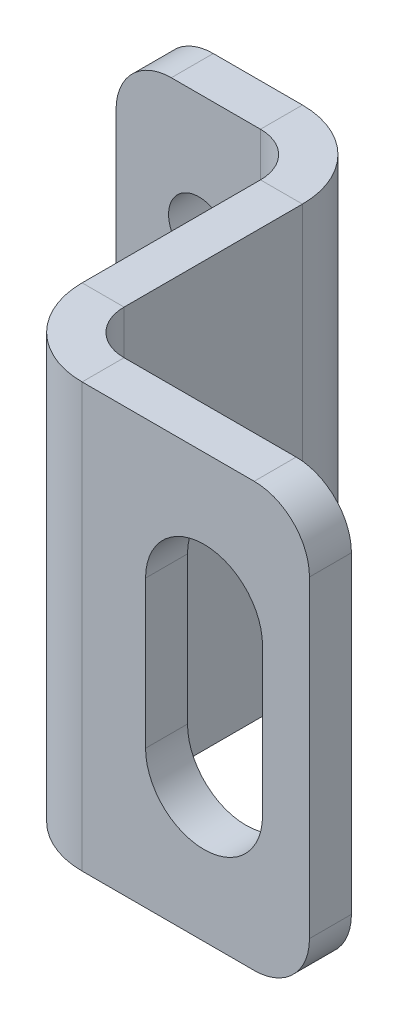
ISO-10303-21;
HEADER;
FILE_DESCRIPTION(('STEP AP214'),'2;1');
FILE_NAME('part.step','',(''),(''),'','','');
FILE_SCHEMA(('AUTOMOTIVE_DESIGN { 1 0 10303 214 1 1 1 1 }'));
ENDSEC;
DATA;
#1=APPLICATION_CONTEXT('core data for automotive mechanical design processes');
#2=APPLICATION_PROTOCOL_DEFINITION('international standard','automotive_design',2000,#1);
#3=PRODUCT_CONTEXT('',#1,'mechanical');
#4=PRODUCT('Part','Part','',(#3));
#5=PRODUCT_RELATED_PRODUCT_CATEGORY('part','',(#4));
#6=PRODUCT_DEFINITION_FORMATION('','',#4);
#7=PRODUCT_DEFINITION_CONTEXT('part definition',#1,'design');
#8=PRODUCT_DEFINITION('design','',#6,#7);
#9=PRODUCT_DEFINITION_SHAPE('','',#8);
#10=(LENGTH_UNIT() NAMED_UNIT(*) SI_UNIT(.MILLI.,.METRE.));
#11=(NAMED_UNIT(*) PLANE_ANGLE_UNIT() SI_UNIT($,.RADIAN.));
#12=(NAMED_UNIT(*) SI_UNIT($,.STERADIAN.) SOLID_ANGLE_UNIT());
#13=UNCERTAINTY_MEASURE_WITH_UNIT(LENGTH_MEASURE(1.E-05),#10,'distance_accuracy_value','');
#14=(GEOMETRIC_REPRESENTATION_CONTEXT(3) GLOBAL_UNCERTAINTY_ASSIGNED_CONTEXT((#13)) GLOBAL_UNIT_ASSIGNED_CONTEXT((#10,
#11,#12)) REPRESENTATION_CONTEXT('',''));
#15=CARTESIAN_POINT('',(0.,0.,0.));
#16=DIRECTION('',(0.,0.,1.));
#17=DIRECTION('',(1.,0.,0.));
#18=AXIS2_PLACEMENT_3D('',#15,#16,#17);
#19=CARTESIAN_POINT('',(1.17093834628434E-13,23.,33.44578));
#20=DIRECTION('',(0.,-1.,0.));
#21=DIRECTION('',(0.,0.,-1.));
#22=AXIS2_PLACEMENT_3D('',#19,#20,#21);
#23=PLANE('',#22);
#24=DIRECTION('',(-1.,0.,0.));
#25=VECTOR('',#24,1.);
#26=CARTESIAN_POINT('',(0.,23.,24.12906));
#27=LINE('',#26,#25);
#28=CARTESIAN_POINT('',(0.,23.,24.12906));
#29=VERTEX_POINT('',#28);
#30=CARTESIAN_POINT('',(-4.55421999999992,23.,24.12906));
#31=VERTEX_POINT('',#30);
#32=EDGE_CURVE('E300',#29,#31,#27,.T.);
#33=ORIENTED_EDGE('',*,*,#32,.F.);
#34=DIRECTION('',(0.,0.,-1.));
#35=VECTOR('',#34,1.);
#36=CARTESIAN_POINT('',(0.,23.,0.));
#37=LINE('',#36,#35);
#38=CARTESIAN_POINT('',(0.,23.,4.76249999999997));
#39=VERTEX_POINT('',#38);
#40=EDGE_CURVE('E308',#39,#29,#37,.F.);
#41=ORIENTED_EDGE('',*,*,#40,.F.);
#42=DIRECTION('',(-1.,0.,0.));
#43=VECTOR('',#42,1.);
#44=CARTESIAN_POINT('',(-4.55421999999998,23.,4.76249999999998));
#45=LINE('',#44,#43);
#46=CARTESIAN_POINT('',(-4.55421999999998,23.,4.76249999999998));
#47=VERTEX_POINT('',#46);
#48=EDGE_CURVE('E319',#47,#39,#45,.F.);
#49=ORIENTED_EDGE('',*,*,#48,.F.);
#50=DIRECTION('',(0.,0.,1.));
#51=VECTOR('',#50,1.);
#52=CARTESIAN_POINT('',(-4.55421999999988,23.,33.44578));
#53=LINE('',#52,#51);
#54=EDGE_CURVE('E313',#47,#31,#53,.T.);
#55=ORIENTED_EDGE('',*,*,#54,.T.);
#56=EDGE_LOOP('',(#33,#41,#49,#55));
#57=FACE_BOUND('',#56,.T.);
#58=ADVANCED_FACE('F78',(#57),#23,.F.);
#59=CARTESIAN_POINT('',(0.,-23.,0.));
#60=DIRECTION('',(0.,1.,0.));
#61=DIRECTION('',(0.,0.,1.));
#62=AXIS2_PLACEMENT_3D('',#59,#60,#61);
#63=PLANE('',#62);
#64=DIRECTION('',(-1.,0.,0.));
#65=VECTOR('',#64,1.);
#66=CARTESIAN_POINT('',(0.,-23.,24.12906));
#67=LINE('',#66,#65);
#68=CARTESIAN_POINT('',(0.,-23.,24.12906));
#69=VERTEX_POINT('',#68);
#70=CARTESIAN_POINT('',(-4.55421999999991,-23.,24.12906));
#71=VERTEX_POINT('',#70);
#72=EDGE_CURVE('E289',#69,#71,#67,.T.);
#73=ORIENTED_EDGE('',*,*,#72,.T.);
#74=DIRECTION('',(0.,0.,-1.));
#75=VECTOR('',#74,1.);
#76=CARTESIAN_POINT('',(-4.55422,-23.,0.));
#77=LINE('',#76,#75);
#78=CARTESIAN_POINT('',(-4.55421999999998,-23.,4.76249999999998));
#79=VERTEX_POINT('',#78);
#80=EDGE_CURVE('E311',#71,#79,#77,.T.);
#81=ORIENTED_EDGE('',*,*,#80,.T.);
#82=DIRECTION('',(-1.,0.,0.));
#83=VECTOR('',#82,1.);
#84=CARTESIAN_POINT('',(0.,-23.,4.76249999999997));
#85=LINE('',#84,#83);
#86=CARTESIAN_POINT('',(0.,-23.,4.76249999999997));
#87=VERTEX_POINT('',#86);
#88=EDGE_CURVE('E303',#79,#87,#85,.F.);
#89=ORIENTED_EDGE('',*,*,#88,.T.);
#90=DIRECTION('',(0.,0.,1.));
#91=VECTOR('',#90,1.);
#92=CARTESIAN_POINT('',(0.,-23.,0.));
#93=LINE('',#92,#91);
#94=EDGE_CURVE('E305',#69,#87,#93,.F.);
#95=ORIENTED_EDGE('',*,*,#94,.F.);
#96=EDGE_LOOP('',(#73,#81,#89,#95));
#97=FACE_BOUND('',#96,.T.);
#98=ADVANCED_FACE('F424',(#97),#63,.F.);
#99=CARTESIAN_POINT('',(0.,0.,0.));
#100=DIRECTION('',(1.,0.,0.));
#101=DIRECTION('',(0.,0.,-1.));
#102=AXIS2_PLACEMENT_3D('',#99,#100,#101);
#103=PLANE('',#102);
#104=ORIENTED_EDGE('',*,*,#40,.T.);
#105=DIRECTION('',(0.,-1.,0.));
#106=VECTOR('',#105,1.);
#107=CARTESIAN_POINT('',(0.,-23.,24.12906));
#108=LINE('',#107,#106);
#109=EDGE_CURVE('E295',#69,#29,#108,.F.);
#110=ORIENTED_EDGE('',*,*,#109,.F.);
#111=ORIENTED_EDGE('',*,*,#94,.T.);
#112=DIRECTION('',(0.,1.,0.));
#113=VECTOR('',#112,1.);
#114=CARTESIAN_POINT('',(0.,0.,4.76249999999997));
#115=LINE('',#114,#113);
#116=EDGE_CURVE('E316',#87,#39,#115,.T.);
#117=ORIENTED_EDGE('',*,*,#116,.T.);
#118=EDGE_LOOP('',(#104,#110,#111,#117));
#119=FACE_BOUND('',#118,.T.);
#120=ADVANCED_FACE('F430',(#119),#103,.T.);
#121=CARTESIAN_POINT('',(-4.55422,0.,0.));
#122=DIRECTION('',(1.,0.,0.));
#123=DIRECTION('',(0.,0.,-1.));
#124=AXIS2_PLACEMENT_3D('',#121,#122,#123);
#125=PLANE('',#124);
#126=DIRECTION('',(0.,-1.,0.));
#127=VECTOR('',#126,1.);
#128=CARTESIAN_POINT('',(-4.55421999999991,-23.,24.12906));
#129=LINE('',#128,#127);
#130=EDGE_CURVE('E283',#71,#31,#129,.F.);
#131=ORIENTED_EDGE('',*,*,#130,.T.);
#132=ORIENTED_EDGE('',*,*,#54,.F.);
#133=DIRECTION('',(0.,-1.,0.));
#134=VECTOR('',#133,1.);
#135=CARTESIAN_POINT('',(-4.55421999999998,-23.,4.76249999999998));
#136=LINE('',#135,#134);
#137=EDGE_CURVE('E322',#79,#47,#136,.F.);
#138=ORIENTED_EDGE('',*,*,#137,.F.);
#139=ORIENTED_EDGE('',*,*,#80,.F.);
#140=EDGE_LOOP('',(#131,#132,#138,#139));
#141=FACE_BOUND('',#140,.T.);
#142=ADVANCED_FACE('F465',(#141),#125,.F.);
#143=CARTESIAN_POINT('',(-25.,23.,-4.55422));
#144=DIRECTION('',(0.,1.,0.));
#145=DIRECTION('',(0.,0.,1.));
#146=AXIS2_PLACEMENT_3D('',#143,#144,#145);
#147=PLANE('',#146);
#148=DIRECTION('',(-1.,0.,0.));
#149=VECTOR('',#148,1.);
#150=CARTESIAN_POINT('',(-25.,23.,-4.55422));
#151=LINE('',#150,#149);
#152=CARTESIAN_POINT('',(-9.31671999999998,23.,-4.55422));
#153=VERTEX_POINT('',#152);
#154=CARTESIAN_POINT('',(-19.,23.,-4.55422));
#155=VERTEX_POINT('',#154);
#156=EDGE_CURVE('E356',#153,#155,#151,.T.);
#157=ORIENTED_EDGE('',*,*,#156,.T.);
#158=DIRECTION('',(0.,0.,1.));
#159=VECTOR('',#158,1.);
#160=CARTESIAN_POINT('',(-19.,23.,-4.55422));
#161=LINE('',#160,#159);
#162=CARTESIAN_POINT('',(-19.,23.,0.));
#163=VERTEX_POINT('',#162);
#164=EDGE_CURVE('E380',#155,#163,#161,.T.);
#165=ORIENTED_EDGE('',*,*,#164,.T.);
#166=DIRECTION('',(-1.,0.,0.));
#167=VECTOR('',#166,1.);
#168=CARTESIAN_POINT('',(-25.,23.,0.));
#169=LINE('',#168,#167);
#170=CARTESIAN_POINT('',(-9.31671999999999,23.,0.));
#171=VERTEX_POINT('',#170);
#172=EDGE_CURVE('E354',#171,#163,#169,.T.);
#173=ORIENTED_EDGE('',*,*,#172,.F.);
#174=DIRECTION('',(0.,0.,-1.));
#175=VECTOR('',#174,1.);
#176=CARTESIAN_POINT('',(-9.31671999999998,23.,0.));
#177=LINE('',#176,#175);
#178=EDGE_CURVE('E333',#171,#153,#177,.T.);
#179=ORIENTED_EDGE('',*,*,#178,.T.);
#180=EDGE_LOOP('',(#157,#165,#173,#179));
#181=FACE_BOUND('',#180,.T.);
#182=ADVANCED_FACE('F457',(#181),#147,.T.);
#183=CARTESIAN_POINT('',(0.,0.,-4.55422));
#184=DIRECTION('',(0.,0.,1.));
#185=DIRECTION('',(1.,0.,0.));
#186=AXIS2_PLACEMENT_3D('',#183,#184,#185);
#187=PLANE('',#186);
#188=CARTESIAN_POINT('',(-16.,10.,-4.55422));
#189=DIRECTION('',(0.,0.,1.));
#190=DIRECTION('',(1.,0.,0.));
#191=AXIS2_PLACEMENT_3D('',#188,#189,#190);
#192=CIRCLE('',#191,3.3);
#193=CARTESIAN_POINT('',(-12.7,10.,-4.55422));
#194=VERTEX_POINT('',#193);
#195=EDGE_CURVE('E246',#194,#194,#192,.T.);
#196=ORIENTED_EDGE('',*,*,#195,.T.);
#197=EDGE_LOOP('',(#196));
#198=FACE_BOUND('',#197,.T.);
#199=CARTESIAN_POINT('',(-16.,-10.,-4.55422));
#200=DIRECTION('',(0.,0.,1.));
#201=DIRECTION('',(1.,0.,0.));
#202=AXIS2_PLACEMENT_3D('',#199,#200,#201);
#203=CIRCLE('',#202,3.3);
#204=CARTESIAN_POINT('',(-12.7,-10.,-4.55422));
#205=VERTEX_POINT('',#204);
#206=EDGE_CURVE('E252',#205,#205,#203,.T.);
#207=ORIENTED_EDGE('',*,*,#206,.T.);
#208=EDGE_LOOP('',(#207));
#209=FACE_BOUND('',#208,.T.);
#210=DIRECTION('',(1.,0.,0.));
#211=VECTOR('',#210,1.);
#212=CARTESIAN_POINT('',(-25.,-23.,-4.55422));
#213=LINE('',#212,#211);
#214=CARTESIAN_POINT('',(-19.,-23.,-4.55422));
#215=VERTEX_POINT('',#214);
#216=CARTESIAN_POINT('',(-9.31671999999998,-22.9999999999999,-4.55422));
#217=VERTEX_POINT('',#216);
#218=EDGE_CURVE('E353',#215,#217,#213,.T.);
#219=ORIENTED_EDGE('',*,*,#218,.F.);
#220=CARTESIAN_POINT('',(-19.,-17.,-4.55422));
#221=DIRECTION('',(0.,0.,1.));
#222=DIRECTION('',(1.,0.,0.));
#223=AXIS2_PLACEMENT_3D('',#220,#221,#222);
#224=CIRCLE('',#223,6.);
#225=CARTESIAN_POINT('',(-25.,-17.,-4.55422));
#226=VERTEX_POINT('',#225);
#227=EDGE_CURVE('E378',#215,#226,#224,.F.);
#228=ORIENTED_EDGE('',*,*,#227,.T.);
#229=DIRECTION('',(0.,-1.,0.));
#230=VECTOR('',#229,1.);
#231=CARTESIAN_POINT('',(-25.,23.,-4.55422));
#232=LINE('',#231,#230);
#233=CARTESIAN_POINT('',(-25.,17.,-4.55422));
#234=VERTEX_POINT('',#233);
#235=EDGE_CURVE('E350',#234,#226,#232,.T.);
#236=ORIENTED_EDGE('',*,*,#235,.F.);
#237=CARTESIAN_POINT('',(-19.,17.,-4.55422));
#238=DIRECTION('',(0.,0.,1.));
#239=DIRECTION('',(1.,0.,0.));
#240=AXIS2_PLACEMENT_3D('',#237,#238,#239);
#241=CIRCLE('',#240,6.);
#242=EDGE_CURVE('E376',#234,#155,#241,.F.);
#243=ORIENTED_EDGE('',*,*,#242,.T.);
#244=ORIENTED_EDGE('',*,*,#156,.F.);
#245=DIRECTION('',(0.,1.,0.));
#246=VECTOR('',#245,1.);
#247=CARTESIAN_POINT('',(-9.31671999999998,23.,-4.55422));
#248=LINE('',#247,#246);
#249=EDGE_CURVE('E326',#153,#217,#248,.F.);
#250=ORIENTED_EDGE('',*,*,#249,.T.);
#251=EDGE_LOOP('',(#219,#228,#236,#243,#244,#250));
#252=FACE_BOUND('',#251,.T.);
#253=ADVANCED_FACE('F453',(#198,#209,#252),#187,.F.);
#254=CARTESIAN_POINT('',(0.,0.,0.));
#255=DIRECTION('',(0.,0.,1.));
#256=DIRECTION('',(1.,0.,0.));
#257=AXIS2_PLACEMENT_3D('',#254,#255,#256);
#258=PLANE('',#257);
#259=CARTESIAN_POINT('',(-16.,10.,0.));
#260=DIRECTION('',(0.,0.,1.));
#261=DIRECTION('',(1.,0.,0.));
#262=AXIS2_PLACEMENT_3D('',#259,#260,#261);
#263=CIRCLE('',#262,3.29999999999999);
#264=CARTESIAN_POINT('',(-12.7,10.,0.));
#265=VERTEX_POINT('',#264);
#266=EDGE_CURVE('E241',#265,#265,#263,.T.);
#267=ORIENTED_EDGE('',*,*,#266,.F.);
#268=EDGE_LOOP('',(#267));
#269=FACE_BOUND('',#268,.T.);
#270=CARTESIAN_POINT('',(-16.,-10.,0.));
#271=DIRECTION('',(0.,0.,1.));
#272=DIRECTION('',(1.,0.,0.));
#273=AXIS2_PLACEMENT_3D('',#270,#271,#272);
#274=CIRCLE('',#273,3.29999999999999);
#275=CARTESIAN_POINT('',(-12.7,-10.,0.));
#276=VERTEX_POINT('',#275);
#277=EDGE_CURVE('E249',#276,#276,#274,.T.);
#278=ORIENTED_EDGE('',*,*,#277,.F.);
#279=EDGE_LOOP('',(#278));
#280=FACE_BOUND('',#279,.T.);
#281=DIRECTION('',(0.,-1.,0.));
#282=VECTOR('',#281,1.);
#283=CARTESIAN_POINT('',(-25.,23.,0.));
#284=LINE('',#283,#282);
#285=CARTESIAN_POINT('',(-25.,17.,0.));
#286=VERTEX_POINT('',#285);
#287=CARTESIAN_POINT('',(-25.,-17.,0.));
#288=VERTEX_POINT('',#287);
#289=EDGE_CURVE('E347',#286,#288,#284,.T.);
#290=ORIENTED_EDGE('',*,*,#289,.T.);
#291=CARTESIAN_POINT('',(-19.,-17.,0.));
#292=DIRECTION('',(0.,0.,1.));
#293=DIRECTION('',(1.,0.,0.));
#294=AXIS2_PLACEMENT_3D('',#291,#292,#293);
#295=CIRCLE('',#294,6.);
#296=CARTESIAN_POINT('',(-19.,-23.,0.));
#297=VERTEX_POINT('',#296);
#298=EDGE_CURVE('E372',#288,#297,#295,.T.);
#299=ORIENTED_EDGE('',*,*,#298,.T.);
#300=DIRECTION('',(1.,0.,0.));
#301=VECTOR('',#300,1.);
#302=CARTESIAN_POINT('',(-25.,-23.,0.));
#303=LINE('',#302,#301);
#304=CARTESIAN_POINT('',(-9.31671999999998,-23.,0.));
#305=VERTEX_POINT('',#304);
#306=EDGE_CURVE('E362',#297,#305,#303,.T.);
#307=ORIENTED_EDGE('',*,*,#306,.T.);
#308=DIRECTION('',(0.,1.,0.));
#309=VECTOR('',#308,1.);
#310=CARTESIAN_POINT('',(-9.31671999999998,23.,0.));
#311=LINE('',#310,#309);
#312=EDGE_CURVE('E339',#171,#305,#311,.F.);
#313=ORIENTED_EDGE('',*,*,#312,.F.);
#314=ORIENTED_EDGE('',*,*,#172,.T.);
#315=CARTESIAN_POINT('',(-19.,17.,0.));
#316=DIRECTION('',(0.,0.,1.));
#317=DIRECTION('',(1.,0.,0.));
#318=AXIS2_PLACEMENT_3D('',#315,#316,#317);
#319=CIRCLE('',#318,6.);
#320=EDGE_CURVE('E370',#163,#286,#319,.T.);
#321=ORIENTED_EDGE('',*,*,#320,.T.);
#322=EDGE_LOOP('',(#290,#299,#307,#313,#314,#321));
#323=FACE_BOUND('',#322,.T.);
#324=ADVANCED_FACE('F456',(#269,#280,#323),#258,.T.);
#325=CARTESIAN_POINT('',(-25.,23.,-4.55422));
#326=DIRECTION('',(-1.,0.,0.));
#327=DIRECTION('',(0.,0.,1.));
#328=AXIS2_PLACEMENT_3D('',#325,#326,#327);
#329=PLANE('',#328);
#330=ORIENTED_EDGE('',*,*,#235,.T.);
#331=DIRECTION('',(0.,0.,1.));
#332=VECTOR('',#331,1.);
#333=CARTESIAN_POINT('',(-25.,-17.,-4.55422));
#334=LINE('',#333,#332);
#335=EDGE_CURVE('E367',#226,#288,#334,.T.);
#336=ORIENTED_EDGE('',*,*,#335,.T.);
#337=ORIENTED_EDGE('',*,*,#289,.F.);
#338=DIRECTION('',(0.,0.,1.));
#339=VECTOR('',#338,1.);
#340=CARTESIAN_POINT('',(-25.,17.,-4.55422));
#341=LINE('',#340,#339);
#342=EDGE_CURVE('E359',#286,#234,#341,.F.);
#343=ORIENTED_EDGE('',*,*,#342,.T.);
#344=EDGE_LOOP('',(#330,#336,#337,#343));
#345=FACE_BOUND('',#344,.T.);
#346=ADVANCED_FACE('F461',(#345),#329,.T.);
#347=CARTESIAN_POINT('',(-25.,-23.,-4.55422));
#348=DIRECTION('',(0.,-1.,0.));
#349=DIRECTION('',(0.,0.,-1.));
#350=AXIS2_PLACEMENT_3D('',#347,#348,#349);
#351=PLANE('',#350);
#352=ORIENTED_EDGE('',*,*,#306,.F.);
#353=DIRECTION('',(0.,0.,1.));
#354=VECTOR('',#353,1.);
#355=CARTESIAN_POINT('',(-19.,-23.,-4.55422));
#356=LINE('',#355,#354);
#357=EDGE_CURVE('E374',#297,#215,#356,.F.);
#358=ORIENTED_EDGE('',*,*,#357,.T.);
#359=ORIENTED_EDGE('',*,*,#218,.T.);
#360=DIRECTION('',(0.,0.,-1.));
#361=VECTOR('',#360,1.);
#362=CARTESIAN_POINT('',(-9.31671999999998,-23.,0.));
#363=LINE('',#362,#361);
#364=EDGE_CURVE('E344',#305,#217,#363,.T.);
#365=ORIENTED_EDGE('',*,*,#364,.F.);
#366=EDGE_LOOP('',(#352,#358,#359,#365));
#367=FACE_BOUND('',#366,.T.);
#368=ADVANCED_FACE('F448',(#367),#351,.T.);
#369=CARTESIAN_POINT('',(-9.31671999999998,-23.,4.7625));
#370=DIRECTION('',(0.,-1.,0.));
#371=DIRECTION('',(0.,0.,-1.));
#372=AXIS2_PLACEMENT_3D('',#369,#370,#371);
#373=PLANE('',#372);
#374=ORIENTED_EDGE('',*,*,#88,.F.);
#375=CARTESIAN_POINT('',(-9.31671999999998,-23.,4.7625));
#376=DIRECTION('',(0.,1.,0.));
#377=DIRECTION('',(0.,0.,1.));
#378=AXIS2_PLACEMENT_3D('',#375,#376,#377);
#379=CIRCLE('',#378,4.7625);
#380=EDGE_CURVE('E336',#305,#79,#379,.F.);
#381=ORIENTED_EDGE('',*,*,#380,.F.);
#382=ORIENTED_EDGE('',*,*,#364,.T.);
#383=CARTESIAN_POINT('',(-9.31671999999998,-23.,4.7625));
#384=DIRECTION('',(0.,1.,0.));
#385=DIRECTION('',(0.,0.,1.));
#386=AXIS2_PLACEMENT_3D('',#383,#384,#385);
#387=CIRCLE('',#386,9.31672);
#388=EDGE_CURVE('E329',#217,#87,#387,.F.);
#389=ORIENTED_EDGE('',*,*,#388,.T.);
#390=EDGE_LOOP('',(#374,#381,#382,#389));
#391=FACE_BOUND('',#390,.T.);
#392=ADVANCED_FACE('F445',(#391),#373,.T.);
#393=CARTESIAN_POINT('',(-9.31671999999998,23.,4.7625));
#394=DIRECTION('',(0.,-1.,0.));
#395=DIRECTION('',(0.,0.,-1.));
#396=AXIS2_PLACEMENT_3D('',#393,#394,#395);
#397=PLANE('',#396);
#398=CARTESIAN_POINT('',(-9.31671999999998,23.,4.7625));
#399=DIRECTION('',(0.,1.,0.));
#400=DIRECTION('',(0.,0.,1.));
#401=AXIS2_PLACEMENT_3D('',#398,#399,#400);
#402=CIRCLE('',#401,4.7625);
#403=EDGE_CURVE('E307',#47,#171,#402,.T.);
#404=ORIENTED_EDGE('',*,*,#403,.F.);
#405=ORIENTED_EDGE('',*,*,#48,.T.);
#406=CARTESIAN_POINT('',(-9.31671999999998,23.,4.7625));
#407=DIRECTION('',(0.,1.,0.));
#408=DIRECTION('',(0.,0.,1.));
#409=AXIS2_PLACEMENT_3D('',#406,#407,#408);
#410=CIRCLE('',#409,9.31672);
#411=EDGE_CURVE('E330',#39,#153,#410,.T.);
#412=ORIENTED_EDGE('',*,*,#411,.T.);
#413=ORIENTED_EDGE('',*,*,#178,.F.);
#414=EDGE_LOOP('',(#404,#405,#412,#413));
#415=FACE_BOUND('',#414,.T.);
#416=ADVANCED_FACE('F439',(#415),#397,.F.);
#417=CARTESIAN_POINT('',(-9.31671999999998,23.,4.7625));
#418=DIRECTION('',(0.,1.,0.));
#419=DIRECTION('',(1.,0.,0.));
#420=AXIS2_PLACEMENT_3D('',#417,#418,#419);
#421=CYLINDRICAL_SURFACE('',#420,9.31672);
#422=ORIENTED_EDGE('',*,*,#249,.F.);
#423=ORIENTED_EDGE('',*,*,#411,.F.);
#424=ORIENTED_EDGE('',*,*,#116,.F.);
#425=ORIENTED_EDGE('',*,*,#388,.F.);
#426=EDGE_LOOP('',(#422,#423,#424,#425));
#427=FACE_BOUND('',#426,.T.);
#428=ADVANCED_FACE('F435',(#427),#421,.T.);
#429=CARTESIAN_POINT('',(-9.31671999999998,23.,4.7625));
#430=DIRECTION('',(0.,1.,0.));
#431=DIRECTION('',(1.,0.,0.));
#432=AXIS2_PLACEMENT_3D('',#429,#430,#431);
#433=CYLINDRICAL_SURFACE('',#432,4.7625);
#434=ORIENTED_EDGE('',*,*,#312,.T.);
#435=ORIENTED_EDGE('',*,*,#380,.T.);
#436=ORIENTED_EDGE('',*,*,#137,.T.);
#437=ORIENTED_EDGE('',*,*,#403,.T.);
#438=EDGE_LOOP('',(#434,#435,#436,#437));
#439=FACE_BOUND('',#438,.T.);
#440=ADVANCED_FACE('F438',(#439),#433,.F.);
#441=CARTESIAN_POINT('',(4.76250000000008,23.,24.12906));
#442=DIRECTION('',(0.,1.,0.));
#443=DIRECTION('',(0.,0.,1.));
#444=AXIS2_PLACEMENT_3D('',#441,#442,#443);
#445=PLANE('',#444);
#446=DIRECTION('',(0.,0.,-1.));
#447=VECTOR('',#446,1.);
#448=CARTESIAN_POINT('',(4.76250000000008,23.,33.44578));
#449=LINE('',#448,#447);
#450=CARTESIAN_POINT('',(4.76250000000008,23.,28.89156));
#451=VERTEX_POINT('',#450);
#452=CARTESIAN_POINT('',(4.76250000000008,23.,33.44578));
#453=VERTEX_POINT('',#452);
#454=EDGE_CURVE('E255',#451,#453,#449,.F.);
#455=ORIENTED_EDGE('',*,*,#454,.F.);
#456=CARTESIAN_POINT('',(4.76250000000008,23.,24.12906));
#457=DIRECTION('',(0.,-1.,0.));
#458=DIRECTION('',(0.,0.,-1.));
#459=AXIS2_PLACEMENT_3D('',#456,#457,#458);
#460=CIRCLE('',#459,4.7625);
#461=EDGE_CURVE('E292',#29,#451,#460,.F.);
#462=ORIENTED_EDGE('',*,*,#461,.F.);
#463=ORIENTED_EDGE('',*,*,#32,.T.);
#464=CARTESIAN_POINT('',(4.76250000000008,23.,24.12906));
#465=DIRECTION('',(0.,-1.,0.));
#466=DIRECTION('',(0.,0.,-1.));
#467=AXIS2_PLACEMENT_3D('',#464,#465,#466);
#468=CIRCLE('',#467,9.31672);
#469=EDGE_CURVE('E285',#31,#453,#468,.F.);
#470=ORIENTED_EDGE('',*,*,#469,.T.);
#471=EDGE_LOOP('',(#455,#462,#463,#470));
#472=FACE_BOUND('',#471,.T.);
#473=ADVANCED_FACE('F443',(#472),#445,.T.);
#474=CARTESIAN_POINT('',(4.76250000000008,-23.,24.12906));
#475=DIRECTION('',(0.,1.,0.));
#476=DIRECTION('',(0.,0.,1.));
#477=AXIS2_PLACEMENT_3D('',#474,#475,#476);
#478=PLANE('',#477);
#479=CARTESIAN_POINT('',(4.76250000000008,-23.,24.12906));
#480=DIRECTION('',(0.,-1.,0.));
#481=DIRECTION('',(0.,0.,-1.));
#482=AXIS2_PLACEMENT_3D('',#479,#480,#481);
#483=CIRCLE('',#482,4.7625);
#484=CARTESIAN_POINT('',(4.76250000000008,-23.,28.89156));
#485=VERTEX_POINT('',#484);
#486=EDGE_CURVE('E258',#485,#69,#483,.T.);
#487=ORIENTED_EDGE('',*,*,#486,.F.);
#488=DIRECTION('',(0.,0.,-1.));
#489=VECTOR('',#488,1.);
#490=CARTESIAN_POINT('',(4.76250000000008,-23.,28.89156));
#491=LINE('',#490,#489);
#492=CARTESIAN_POINT('',(4.76250000000008,-23.,33.44578));
#493=VERTEX_POINT('',#492);
#494=EDGE_CURVE('E276',#485,#493,#491,.F.);
#495=ORIENTED_EDGE('',*,*,#494,.T.);
#496=CARTESIAN_POINT('',(4.76250000000008,-23.,24.12906));
#497=DIRECTION('',(0.,-1.,0.));
#498=DIRECTION('',(0.,0.,-1.));
#499=AXIS2_PLACEMENT_3D('',#496,#497,#498);
#500=CIRCLE('',#499,9.31672);
#501=EDGE_CURVE('E286',#493,#71,#500,.T.);
#502=ORIENTED_EDGE('',*,*,#501,.T.);
#503=ORIENTED_EDGE('',*,*,#72,.F.);
#504=EDGE_LOOP('',(#487,#495,#502,#503));
#505=FACE_BOUND('',#504,.T.);
#506=ADVANCED_FACE('F513',(#505),#478,.F.);
#507=CARTESIAN_POINT('',(4.76250000000008,-23.,24.12906));
#508=DIRECTION('',(0.,-1.,0.));
#509=DIRECTION('',(0.,0.,1.));
#510=AXIS2_PLACEMENT_3D('',#507,#508,#509);
#511=CYLINDRICAL_SURFACE('',#510,9.31672);
#512=ORIENTED_EDGE('',*,*,#130,.F.);
#513=ORIENTED_EDGE('',*,*,#501,.F.);
#514=DIRECTION('',(0.,-1.,0.));
#515=VECTOR('',#514,1.);
#516=CARTESIAN_POINT('',(4.76250000000008,0.,33.44578));
#517=LINE('',#516,#515);
#518=EDGE_CURVE('E273',#453,#493,#517,.T.);
#519=ORIENTED_EDGE('',*,*,#518,.F.);
#520=ORIENTED_EDGE('',*,*,#469,.F.);
#521=EDGE_LOOP('',(#512,#513,#519,#520));
#522=FACE_BOUND('',#521,.T.);
#523=ADVANCED_FACE('F518',(#522),#511,.T.);
#524=CARTESIAN_POINT('',(4.76250000000008,-23.,24.12906));
#525=DIRECTION('',(0.,-1.,0.));
#526=DIRECTION('',(0.,0.,1.));
#527=AXIS2_PLACEMENT_3D('',#524,#525,#526);
#528=CYLINDRICAL_SURFACE('',#527,4.7625);
#529=ORIENTED_EDGE('',*,*,#109,.T.);
#530=ORIENTED_EDGE('',*,*,#461,.T.);
#531=DIRECTION('',(0.,1.,0.));
#532=VECTOR('',#531,1.);
#533=CARTESIAN_POINT('',(4.76250000000008,23.,28.89156));
#534=LINE('',#533,#532);
#535=EDGE_CURVE('E279',#451,#485,#534,.F.);
#536=ORIENTED_EDGE('',*,*,#535,.T.);
#537=ORIENTED_EDGE('',*,*,#486,.T.);
#538=EDGE_LOOP('',(#529,#530,#536,#537));
#539=FACE_BOUND('',#538,.T.);
#540=ADVANCED_FACE('F503',(#539),#528,.F.);
#541=CARTESIAN_POINT('',(29.4457800000001,-23.,33.44578));
#542=DIRECTION('',(0.,1.,0.));
#543=DIRECTION('',(-1.,0.,0.));
#544=AXIS2_PLACEMENT_3D('',#541,#542,#543);
#545=PLANE('',#544);
#546=DIRECTION('',(1.,0.,0.));
#547=VECTOR('',#546,1.);
#548=CARTESIAN_POINT('',(29.4457800000001,-23.,28.89156));
#549=LINE('',#548,#547);
#550=CARTESIAN_POINT('',(23.4457800000001,-23.,28.89156));
#551=VERTEX_POINT('',#550);
#552=EDGE_CURVE('E270',#485,#551,#549,.T.);
#553=ORIENTED_EDGE('',*,*,#552,.T.);
#554=DIRECTION('',(0.,0.,-1.));
#555=VECTOR('',#554,1.);
#556=CARTESIAN_POINT('',(23.4457800000001,-23.,33.44578));
#557=LINE('',#556,#555);
#558=CARTESIAN_POINT('',(23.4457800000001,-23.,33.44578));
#559=VERTEX_POINT('',#558);
#560=EDGE_CURVE('E399',#551,#559,#557,.F.);
#561=ORIENTED_EDGE('',*,*,#560,.T.);
#562=DIRECTION('',(-1.,0.,0.));
#563=VECTOR('',#562,1.);
#564=CARTESIAN_POINT('',(0.,-23.,33.44578));
#565=LINE('',#564,#563);
#566=EDGE_CURVE('E262',#493,#559,#565,.F.);
#567=ORIENTED_EDGE('',*,*,#566,.F.);
#568=ORIENTED_EDGE('',*,*,#494,.F.);
#569=EDGE_LOOP('',(#553,#561,#567,#568));
#570=FACE_BOUND('',#569,.T.);
#571=ADVANCED_FACE('F511',(#570),#545,.F.);
#572=CARTESIAN_POINT('',(1.00874342590067E-13,23.,33.44578));
#573=DIRECTION('',(0.,-1.,0.));
#574=DIRECTION('',(0.,0.,-1.));
#575=AXIS2_PLACEMENT_3D('',#572,#573,#574);
#576=PLANE('',#575);
#577=DIRECTION('',(1.,0.,0.));
#578=VECTOR('',#577,1.);
#579=CARTESIAN_POINT('',(0.,23.,33.44578));
#580=LINE('',#579,#578);
#581=CARTESIAN_POINT('',(23.4457800000001,23.,33.44578));
#582=VERTEX_POINT('',#581);
#583=EDGE_CURVE('E256',#582,#453,#580,.F.);
#584=ORIENTED_EDGE('',*,*,#583,.F.);
#585=DIRECTION('',(0.,0.,-1.));
#586=VECTOR('',#585,1.);
#587=CARTESIAN_POINT('',(23.4457800000001,23.,33.44578));
#588=LINE('',#587,#586);
#589=CARTESIAN_POINT('',(23.4457800000001,23.,28.89156));
#590=VERTEX_POINT('',#589);
#591=EDGE_CURVE('E383',#582,#590,#588,.T.);
#592=ORIENTED_EDGE('',*,*,#591,.T.);
#593=DIRECTION('',(-1.,0.,0.));
#594=VECTOR('',#593,1.);
#595=CARTESIAN_POINT('',(1.00874342590067E-13,23.,28.89156));
#596=LINE('',#595,#594);
#597=EDGE_CURVE('E265',#590,#451,#596,.T.);
#598=ORIENTED_EDGE('',*,*,#597,.T.);
#599=ORIENTED_EDGE('',*,*,#454,.T.);
#600=EDGE_LOOP('',(#584,#592,#598,#599));
#601=FACE_BOUND('',#600,.T.);
#602=ADVANCED_FACE('F495',(#601),#576,.F.);
#603=CARTESIAN_POINT('',(0.,0.,33.44578));
#604=DIRECTION('',(0.,0.,1.));
#605=DIRECTION('',(1.,0.,0.));
#606=AXIS2_PLACEMENT_3D('',#603,#604,#605);
#607=PLANE('',#606);
#608=CARTESIAN_POINT('',(18.,-8.,33.4457799999999));
#609=DIRECTION('',(0.,0.,1.));
#610=DIRECTION('',(1.,0.,0.));
#611=AXIS2_PLACEMENT_3D('',#608,#609,#610);
#612=CIRCLE('',#611,6.35);
#613=CARTESIAN_POINT('',(11.65,-8.,33.4457799999999));
#614=VERTEX_POINT('',#613);
#615=CARTESIAN_POINT('',(24.35,-8.,33.44578));
#616=VERTEX_POINT('',#615);
#617=EDGE_CURVE('E93',#614,#616,#612,.T.);
#618=ORIENTED_EDGE('',*,*,#617,.F.);
#619=DIRECTION('',(0.,-1.,0.));
#620=VECTOR('',#619,1.);
#621=CARTESIAN_POINT('',(11.65,-8.,33.4457799999999));
#622=LINE('',#621,#620);
#623=CARTESIAN_POINT('',(11.65,8.,33.4457799999999));
#624=VERTEX_POINT('',#623);
#625=EDGE_CURVE('E234',#624,#614,#622,.T.);
#626=ORIENTED_EDGE('',*,*,#625,.F.);
#627=CARTESIAN_POINT('',(18.,8.,33.4457799999999));
#628=DIRECTION('',(0.,0.,1.));
#629=DIRECTION('',(1.,0.,0.));
#630=AXIS2_PLACEMENT_3D('',#627,#628,#629);
#631=CIRCLE('',#630,6.35);
#632=CARTESIAN_POINT('',(24.35,8.,33.4457799999999));
#633=VERTEX_POINT('',#632);
#634=EDGE_CURVE('E218',#633,#624,#631,.T.);
#635=ORIENTED_EDGE('',*,*,#634,.F.);
#636=DIRECTION('',(0.,1.,0.));
#637=VECTOR('',#636,1.);
#638=CARTESIAN_POINT('',(24.35,-8.,33.4457799999999));
#639=LINE('',#638,#637);
#640=EDGE_CURVE('E227',#616,#633,#639,.T.);
#641=ORIENTED_EDGE('',*,*,#640,.F.);
#642=EDGE_LOOP('',(#618,#626,#635,#641));
#643=FACE_BOUND('',#642,.T.);
#644=DIRECTION('',(0.,-1.,0.));
#645=VECTOR('',#644,1.);
#646=CARTESIAN_POINT('',(29.4457800000001,0.,33.44578));
#647=LINE('',#646,#645);
#648=CARTESIAN_POINT('',(29.4457800000001,-17.,33.44578));
#649=VERTEX_POINT('',#648);
#650=CARTESIAN_POINT('',(29.4457800000001,17.,33.44578));
#651=VERTEX_POINT('',#650);
#652=EDGE_CURVE('E259',#649,#651,#647,.F.);
#653=ORIENTED_EDGE('',*,*,#652,.T.);
#654=CARTESIAN_POINT('',(23.4457800000001,17.,33.44578));
#655=DIRECTION('',(0.,0.,1.));
#656=DIRECTION('',(1.,0.,0.));
#657=AXIS2_PLACEMENT_3D('',#654,#655,#656);
#658=CIRCLE('',#657,6.);
#659=EDGE_CURVE('E397',#651,#582,#658,.T.);
#660=ORIENTED_EDGE('',*,*,#659,.T.);
#661=ORIENTED_EDGE('',*,*,#583,.T.);
#662=ORIENTED_EDGE('',*,*,#518,.T.);
#663=ORIENTED_EDGE('',*,*,#566,.T.);
#664=CARTESIAN_POINT('',(23.4457800000001,-17.,33.44578));
#665=DIRECTION('',(0.,0.,1.));
#666=DIRECTION('',(1.,0.,0.));
#667=AXIS2_PLACEMENT_3D('',#664,#665,#666);
#668=CIRCLE('',#667,6.);
#669=EDGE_CURVE('E395',#559,#649,#668,.T.);
#670=ORIENTED_EDGE('',*,*,#669,.T.);
#671=EDGE_LOOP('',(#653,#660,#661,#662,#663,#670));
#672=FACE_BOUND('',#671,.T.);
#673=ADVANCED_FACE('F231',(#643,#672),#607,.T.);
#674=CARTESIAN_POINT('',(0.,0.,28.89156));
#675=DIRECTION('',(0.,0.,1.));
#676=DIRECTION('',(1.,0.,0.));
#677=AXIS2_PLACEMENT_3D('',#674,#675,#676);
#678=PLANE('',#677);
#679=DIRECTION('',(0.,-1.,0.));
#680=VECTOR('',#679,1.);
#681=CARTESIAN_POINT('',(11.65,0.,28.89156));
#682=LINE('',#681,#680);
#683=CARTESIAN_POINT('',(11.65,8.,28.89156));
#684=VERTEX_POINT('',#683);
#685=CARTESIAN_POINT('',(11.65,-8.,28.89156));
#686=VERTEX_POINT('',#685);
#687=EDGE_CURVE('E86',#684,#686,#682,.T.);
#688=ORIENTED_EDGE('',*,*,#687,.T.);
#689=CARTESIAN_POINT('',(18.,-8.,28.89156));
#690=DIRECTION('',(0.,0.,1.));
#691=DIRECTION('',(1.,0.,0.));
#692=AXIS2_PLACEMENT_3D('',#689,#690,#691);
#693=CIRCLE('',#692,6.35);
#694=CARTESIAN_POINT('',(24.35,-8.,28.89156));
#695=VERTEX_POINT('',#694);
#696=EDGE_CURVE('E13',#686,#695,#693,.T.);
#697=ORIENTED_EDGE('',*,*,#696,.T.);
#698=DIRECTION('',(0.,1.,0.));
#699=VECTOR('',#698,1.);
#700=CARTESIAN_POINT('',(24.35,0.,28.89156));
#701=LINE('',#700,#699);
#702=CARTESIAN_POINT('',(24.35,8.,28.89156));
#703=VERTEX_POINT('',#702);
#704=EDGE_CURVE('E401',#695,#703,#701,.T.);
#705=ORIENTED_EDGE('',*,*,#704,.T.);
#706=CARTESIAN_POINT('',(18.,8.,28.89156));
#707=DIRECTION('',(0.,0.,1.));
#708=DIRECTION('',(1.,0.,0.));
#709=AXIS2_PLACEMENT_3D('',#706,#707,#708);
#710=CIRCLE('',#709,6.35);
#711=EDGE_CURVE('E221',#703,#684,#710,.T.);
#712=ORIENTED_EDGE('',*,*,#711,.T.);
#713=EDGE_LOOP('',(#688,#697,#705,#712));
#714=FACE_BOUND('',#713,.T.);
#715=ORIENTED_EDGE('',*,*,#597,.F.);
#716=CARTESIAN_POINT('',(23.4457800000001,17.,28.89156));
#717=DIRECTION('',(0.,0.,1.));
#718=DIRECTION('',(1.,0.,0.));
#719=AXIS2_PLACEMENT_3D('',#716,#717,#718);
#720=CIRCLE('',#719,6.);
#721=CARTESIAN_POINT('',(29.4457800000001,17.,28.89156));
#722=VERTEX_POINT('',#721);
#723=EDGE_CURVE('E388',#590,#722,#720,.F.);
#724=ORIENTED_EDGE('',*,*,#723,.T.);
#725=DIRECTION('',(0.,1.,0.));
#726=VECTOR('',#725,1.);
#727=CARTESIAN_POINT('',(29.4457800000001,23.,28.89156));
#728=LINE('',#727,#726);
#729=CARTESIAN_POINT('',(29.4457800000001,-17.,28.89156));
#730=VERTEX_POINT('',#729);
#731=EDGE_CURVE('E267',#730,#722,#728,.T.);
#732=ORIENTED_EDGE('',*,*,#731,.F.);
#733=CARTESIAN_POINT('',(23.4457800000001,-17.,28.89156));
#734=DIRECTION('',(0.,0.,1.));
#735=DIRECTION('',(1.,0.,0.));
#736=AXIS2_PLACEMENT_3D('',#733,#734,#735);
#737=CIRCLE('',#736,6.);
#738=EDGE_CURVE('E386',#730,#551,#737,.F.);
#739=ORIENTED_EDGE('',*,*,#738,.T.);
#740=ORIENTED_EDGE('',*,*,#552,.F.);
#741=ORIENTED_EDGE('',*,*,#535,.F.);
#742=EDGE_LOOP('',(#715,#724,#732,#739,#740,#741));
#743=FACE_BOUND('',#742,.T.);
#744=ADVANCED_FACE('F405',(#714,#743),#678,.F.);
#745=CARTESIAN_POINT('',(29.4457800000001,23.,33.44578));
#746=DIRECTION('',(-1.,0.,0.));
#747=DIRECTION('',(0.,0.,1.));
#748=AXIS2_PLACEMENT_3D('',#745,#746,#747);
#749=PLANE('',#748);
#750=ORIENTED_EDGE('',*,*,#731,.T.);
#751=DIRECTION('',(0.,0.,-1.));
#752=VECTOR('',#751,1.);
#753=CARTESIAN_POINT('',(29.4457800000001,17.,33.44578));
#754=LINE('',#753,#752);
#755=EDGE_CURVE('E393',#722,#651,#754,.F.);
#756=ORIENTED_EDGE('',*,*,#755,.T.);
#757=ORIENTED_EDGE('',*,*,#652,.F.);
#758=DIRECTION('',(0.,0.,-1.));
#759=VECTOR('',#758,1.);
#760=CARTESIAN_POINT('',(29.4457800000001,-17.,33.44578));
#761=LINE('',#760,#759);
#762=EDGE_CURVE('E390',#649,#730,#761,.T.);
#763=ORIENTED_EDGE('',*,*,#762,.T.);
#764=EDGE_LOOP('',(#750,#756,#757,#763));
#765=FACE_BOUND('',#764,.T.);
#766=ADVANCED_FACE('F477',(#765),#749,.F.);
#767=CARTESIAN_POINT('',(-19.,-17.,-4.55422));
#768=DIRECTION('',(0.,0.,1.));
#769=DIRECTION('',(1.,0.,0.));
#770=AXIS2_PLACEMENT_3D('',#767,#768,#769);
#771=CYLINDRICAL_SURFACE('',#770,6.);
#772=ORIENTED_EDGE('',*,*,#227,.F.);
#773=ORIENTED_EDGE('',*,*,#357,.F.);
#774=ORIENTED_EDGE('',*,*,#298,.F.);
#775=ORIENTED_EDGE('',*,*,#335,.F.);
#776=EDGE_LOOP('',(#772,#773,#774,#775));
#777=FACE_BOUND('',#776,.T.);
#778=ADVANCED_FACE('F473',(#777),#771,.T.);
#779=CARTESIAN_POINT('',(-19.,17.,-4.55422));
#780=DIRECTION('',(0.,0.,1.));
#781=DIRECTION('',(1.,0.,0.));
#782=AXIS2_PLACEMENT_3D('',#779,#780,#781);
#783=CYLINDRICAL_SURFACE('',#782,6.);
#784=ORIENTED_EDGE('',*,*,#242,.F.);
#785=ORIENTED_EDGE('',*,*,#342,.F.);
#786=ORIENTED_EDGE('',*,*,#320,.F.);
#787=ORIENTED_EDGE('',*,*,#164,.F.);
#788=EDGE_LOOP('',(#784,#785,#786,#787));
#789=FACE_BOUND('',#788,.T.);
#790=ADVANCED_FACE('F476',(#789),#783,.T.);
#791=CARTESIAN_POINT('',(23.4457800000001,17.,33.44578));
#792=DIRECTION('',(0.,0.,-1.));
#793=DIRECTION('',(-1.,0.,0.));
#794=AXIS2_PLACEMENT_3D('',#791,#792,#793);
#795=CYLINDRICAL_SURFACE('',#794,6.);
#796=ORIENTED_EDGE('',*,*,#659,.F.);
#797=ORIENTED_EDGE('',*,*,#755,.F.);
#798=ORIENTED_EDGE('',*,*,#723,.F.);
#799=ORIENTED_EDGE('',*,*,#591,.F.);
#800=EDGE_LOOP('',(#796,#797,#798,#799));
#801=FACE_BOUND('',#800,.T.);
#802=ADVANCED_FACE('F480',(#801),#795,.T.);
#803=CARTESIAN_POINT('',(23.4457800000001,-17.,33.44578));
#804=DIRECTION('',(0.,0.,-1.));
#805=DIRECTION('',(-1.,0.,0.));
#806=AXIS2_PLACEMENT_3D('',#803,#804,#805);
#807=CYLINDRICAL_SURFACE('',#806,6.);
#808=ORIENTED_EDGE('',*,*,#669,.F.);
#809=ORIENTED_EDGE('',*,*,#560,.F.);
#810=ORIENTED_EDGE('',*,*,#738,.F.);
#811=ORIENTED_EDGE('',*,*,#762,.F.);
#812=EDGE_LOOP('',(#808,#809,#810,#811));
#813=FACE_BOUND('',#812,.T.);
#814=ADVANCED_FACE('F80',(#813),#807,.T.);
#815=CARTESIAN_POINT('',(-16.,-10.,0.));
#816=DIRECTION('',(0.,0.,1.));
#817=DIRECTION('',(1.,0.,0.));
#818=AXIS2_PLACEMENT_3D('',#815,#816,#817);
#819=CYLINDRICAL_SURFACE('',#818,3.29999999999999);
#820=ORIENTED_EDGE('',*,*,#206,.F.);
#821=EDGE_LOOP('',(#820));
#822=FACE_BOUND('',#821,.T.);
#823=ORIENTED_EDGE('',*,*,#277,.T.);
#824=EDGE_LOOP('',(#823));
#825=FACE_BOUND('',#824,.T.);
#826=ADVANCED_FACE('F419',(#822,#825),#819,.F.);
#827=CARTESIAN_POINT('',(-16.,10.,0.));
#828=DIRECTION('',(0.,0.,1.));
#829=DIRECTION('',(1.,0.,0.));
#830=AXIS2_PLACEMENT_3D('',#827,#828,#829);
#831=CYLINDRICAL_SURFACE('',#830,3.29999999999999);
#832=ORIENTED_EDGE('',*,*,#195,.F.);
#833=EDGE_LOOP('',(#832));
#834=FACE_BOUND('',#833,.T.);
#835=ORIENTED_EDGE('',*,*,#266,.T.);
#836=EDGE_LOOP('',(#835));
#837=FACE_BOUND('',#836,.T.);
#838=ADVANCED_FACE('F412',(#834,#837),#831,.F.);
#839=CARTESIAN_POINT('',(18.,-8.,-4.55422));
#840=DIRECTION('',(0.,0.,1.));
#841=DIRECTION('',(1.,0.,0.));
#842=AXIS2_PLACEMENT_3D('',#839,#840,#841);
#843=CYLINDRICAL_SURFACE('',#842,6.35);
#844=DIRECTION('',(0.,0.,1.));
#845=VECTOR('',#844,1.);
#846=CARTESIAN_POINT('',(11.65,-8.,-4.55422));
#847=LINE('',#846,#845);
#848=EDGE_CURVE('E239',#686,#614,#847,.T.);
#849=ORIENTED_EDGE('',*,*,#848,.T.);
#850=ORIENTED_EDGE('',*,*,#617,.T.);
#851=DIRECTION('',(0.,0.,1.));
#852=VECTOR('',#851,1.);
#853=CARTESIAN_POINT('',(24.35,-8.,-4.55422));
#854=LINE('',#853,#852);
#855=EDGE_CURVE('E224',#695,#616,#854,.T.);
#856=ORIENTED_EDGE('',*,*,#855,.F.);
#857=ORIENTED_EDGE('',*,*,#696,.F.);
#858=EDGE_LOOP('',(#849,#850,#856,#857));
#859=FACE_BOUND('',#858,.T.);
#860=ADVANCED_FACE('F410',(#859),#843,.F.);
#861=CARTESIAN_POINT('',(11.65,-8.,-4.55422));
#862=DIRECTION('',(-1.,0.,0.));
#863=DIRECTION('',(0.,-1.,0.));
#864=AXIS2_PLACEMENT_3D('',#861,#862,#863);
#865=PLANE('',#864);
#866=DIRECTION('',(0.,0.,1.));
#867=VECTOR('',#866,1.);
#868=CARTESIAN_POINT('',(11.65,8.,-4.55422));
#869=LINE('',#868,#867);
#870=EDGE_CURVE('E223',#684,#624,#869,.T.);
#871=ORIENTED_EDGE('',*,*,#870,.T.);
#872=ORIENTED_EDGE('',*,*,#625,.T.);
#873=ORIENTED_EDGE('',*,*,#848,.F.);
#874=ORIENTED_EDGE('',*,*,#687,.F.);
#875=EDGE_LOOP('',(#871,#872,#873,#874));
#876=FACE_BOUND('',#875,.T.);
#877=ADVANCED_FACE('F409',(#876),#865,.F.);
#878=CARTESIAN_POINT('',(18.,8.,-4.55422));
#879=DIRECTION('',(0.,0.,1.));
#880=DIRECTION('',(1.,0.,0.));
#881=AXIS2_PLACEMENT_3D('',#878,#879,#880);
#882=CYLINDRICAL_SURFACE('',#881,6.35);
#883=DIRECTION('',(0.,0.,1.));
#884=VECTOR('',#883,1.);
#885=CARTESIAN_POINT('',(24.35,8.,-4.55422));
#886=LINE('',#885,#884);
#887=EDGE_CURVE('E101',#703,#633,#886,.T.);
#888=ORIENTED_EDGE('',*,*,#887,.T.);
#889=ORIENTED_EDGE('',*,*,#634,.T.);
#890=ORIENTED_EDGE('',*,*,#870,.F.);
#891=ORIENTED_EDGE('',*,*,#711,.F.);
#892=EDGE_LOOP('',(#888,#889,#890,#891));
#893=FACE_BOUND('',#892,.T.);
#894=ADVANCED_FACE('F215',(#893),#882,.F.);
#895=CARTESIAN_POINT('',(24.35,-8.,-4.55422));
#896=DIRECTION('',(1.,0.,0.));
#897=DIRECTION('',(0.,0.,-1.));
#898=AXIS2_PLACEMENT_3D('',#895,#896,#897);
#899=PLANE('',#898);
#900=ORIENTED_EDGE('',*,*,#855,.T.);
#901=ORIENTED_EDGE('',*,*,#640,.T.);
#902=ORIENTED_EDGE('',*,*,#887,.F.);
#903=ORIENTED_EDGE('',*,*,#704,.F.);
#904=EDGE_LOOP('',(#900,#901,#902,#903));
#905=FACE_BOUND('',#904,.T.);
#906=ADVANCED_FACE('F228',(#905),#899,.F.);
#907=CLOSED_SHELL('',(#58,#98,#120,#142,#182,#253,#324,#346,#368,#392,#416,#428,#440,#473,#506,
#523,#540,#571,#602,#673,#744,#766,#778,#790,#802,#814,#826,#838,#860,#877,#894,#906));
#908=MANIFOLD_SOLID_BREP('B2',#907);
#909=ADVANCED_BREP_SHAPE_REPRESENTATION('',(#18,#908),#14);
#910=SHAPE_DEFINITION_REPRESENTATION(#9,#909);
ENDSEC;
END-ISO-10303-21;
